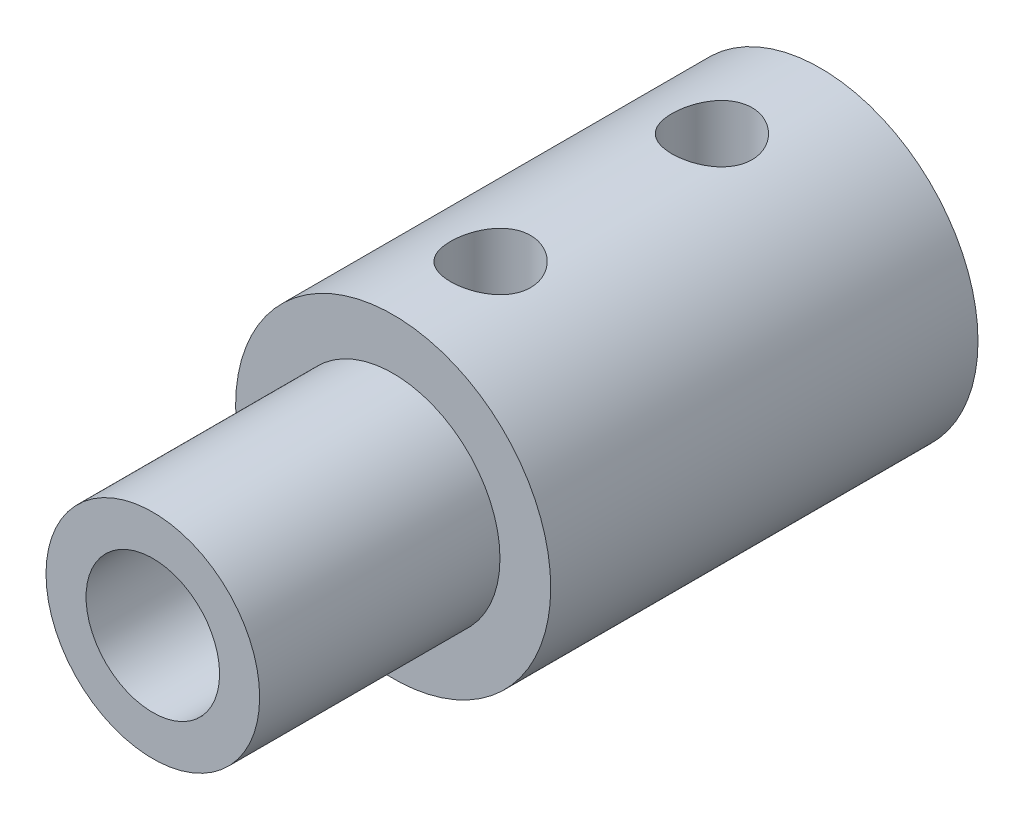
ISO-10303-21;
HEADER;
FILE_DESCRIPTION(('STEP AP214'),'2;1');
FILE_NAME('part.step','',(''),(''),'','','');
FILE_SCHEMA(('AUTOMOTIVE_DESIGN { 1 0 10303 214 1 1 1 1 }'));
ENDSEC;
DATA;
#1=APPLICATION_CONTEXT('core data for automotive mechanical design processes');
#2=APPLICATION_PROTOCOL_DEFINITION('international standard','automotive_design',2000,#1);
#3=PRODUCT_CONTEXT('',#1,'mechanical');
#4=PRODUCT('Part','Part','',(#3));
#5=PRODUCT_RELATED_PRODUCT_CATEGORY('part','',(#4));
#6=PRODUCT_DEFINITION_FORMATION('','',#4);
#7=PRODUCT_DEFINITION_CONTEXT('part definition',#1,'design');
#8=PRODUCT_DEFINITION('design','',#6,#7);
#9=PRODUCT_DEFINITION_SHAPE('','',#8);
#10=(LENGTH_UNIT() NAMED_UNIT(*) SI_UNIT(.MILLI.,.METRE.));
#11=(NAMED_UNIT(*) PLANE_ANGLE_UNIT() SI_UNIT($,.RADIAN.));
#12=(NAMED_UNIT(*) SI_UNIT($,.STERADIAN.) SOLID_ANGLE_UNIT());
#13=UNCERTAINTY_MEASURE_WITH_UNIT(LENGTH_MEASURE(1.E-05),#10,'distance_accuracy_value','');
#14=(GEOMETRIC_REPRESENTATION_CONTEXT(3) GLOBAL_UNCERTAINTY_ASSIGNED_CONTEXT((#13)) GLOBAL_UNIT_ASSIGNED_CONTEXT((#10,
#11,#12)) REPRESENTATION_CONTEXT('',''));
#15=CARTESIAN_POINT('',(0.,0.,0.));
#16=DIRECTION('',(0.,0.,1.));
#17=DIRECTION('',(1.,0.,0.));
#18=AXIS2_PLACEMENT_3D('',#15,#16,#17);
#19=CARTESIAN_POINT('',(0.,0.,25.));
#20=DIRECTION('',(0.,0.,-1.));
#21=DIRECTION('',(-1.,0.,0.));
#22=AXIS2_PLACEMENT_3D('',#19,#20,#21);
#23=CYLINDRICAL_SURFACE('',#22,5.9);
#24=CARTESIAN_POINT('',(0.,0.,0.));
#25=DIRECTION('',(0.,0.,1.));
#26=DIRECTION('',(1.,0.,0.));
#27=AXIS2_PLACEMENT_3D('',#24,#25,#26);
#28=CIRCLE('',#27,5.9);
#29=CARTESIAN_POINT('',(5.9,0.,0.));
#30=VERTEX_POINT('',#29);
#31=EDGE_CURVE('E136',#30,#30,#28,.T.);
#32=ORIENTED_EDGE('',*,*,#31,.T.);
#33=EDGE_LOOP('',(#32));
#34=FACE_BOUND('',#33,.T.);
#35=CARTESIAN_POINT('',(0.,5.9,5.56318232203257));
#36=CARTESIAN_POINT('',(-0.0828300382499491,5.89999863185022,5.5631800820789));
#37=CARTESIAN_POINT('',(-0.165684832863688,5.89823839931484,5.5562984452127));
#38=CARTESIAN_POINT('',(-0.329016763273005,5.89138713946882,5.52899680601431));
#39=CARTESIAN_POINT('',(-0.409492577152412,5.88629429539872,5.50856941919102));
#40=CARTESIAN_POINT('',(-0.565684557209917,5.87334130935857,5.45487639515155));
#41=CARTESIAN_POINT('',(-0.641406413346794,5.86548455288059,5.42162645938982));
#42=CARTESIAN_POINT('',(-0.786197875180384,5.84783888653407,5.34328816441978));
#43=CARTESIAN_POINT('',(-0.855267201012286,5.83804989543126,5.29819930745782));
#44=CARTESIAN_POINT('',(-0.986260236282176,5.81736852160733,5.19645145540983));
#45=CARTESIAN_POINT('',(-1.04802249224729,5.80645865200954,5.13958814605744));
#46=CARTESIAN_POINT('',(-1.16124449896803,5.78488032866515,5.01634279694619));
#47=CARTESIAN_POINT('',(-1.21270304730156,5.77421190322332,4.94995964779057));
#48=CARTESIAN_POINT('',(-1.30462316017259,5.75414745591023,4.80829665143822));
#49=CARTESIAN_POINT('',(-1.34490284311052,5.74477360042579,4.73289536205567));
#50=CARTESIAN_POINT('',(-1.4121517223974,5.72861518109046,4.57611467427445));
#51=CARTESIAN_POINT('',(-1.43912312697355,5.72183018771506,4.4947362702277));
#52=CARTESIAN_POINT('',(-1.47843656787613,5.71179764583944,4.33008994340507));
#53=CARTESIAN_POINT('',(-1.49106951185751,5.70847986708464,4.24689586218846));
#54=CARTESIAN_POINT('',(-1.5022537680738,5.70554728281267,4.07950813462008));
#55=CARTESIAN_POINT('',(-1.50080745483598,5.70593185287833,3.99531465921265));
#56=CARTESIAN_POINT('',(-1.48410606772934,5.71029745273476,3.83055775914648));
#57=CARTESIAN_POINT('',(-1.46919896212241,5.71418785001937,3.7499562826809));
#58=CARTESIAN_POINT('',(-1.42655478807359,5.72498214747374,3.59243755934651));
#59=CARTESIAN_POINT('',(-1.39881677783028,5.73188626885181,3.5155205833812));
#60=CARTESIAN_POINT('',(-1.33100488852097,5.74801240949616,3.36662767735329));
#61=CARTESIAN_POINT('',(-1.29080579577386,5.75725777350398,3.29471140945088));
#62=CARTESIAN_POINT('',(-1.19930036134028,5.77701165833937,3.15852104401564));
#63=CARTESIAN_POINT('',(-1.14799201509948,5.78752040697974,3.09424832893276));
#64=CARTESIAN_POINT('',(-1.03392786808934,5.80899752020269,2.97317692765593));
#65=CARTESIAN_POINT('',(-0.970878777414768,5.81997029361514,2.91665498131969));
#66=CARTESIAN_POINT('',(-0.836064673045031,5.84085966687947,2.81493297861713));
#67=CARTESIAN_POINT('',(-0.764299375001822,5.85077623225495,2.76973329176325));
#68=CARTESIAN_POINT('',(-0.61368678962163,5.86848800026142,2.69183225826974));
#69=CARTESIAN_POINT('',(-0.534814607701236,5.87627532733138,2.65917713551393));
#70=CARTESIAN_POINT('',(-0.372457781193937,5.88879402296901,2.60766712679283));
#71=CARTESIAN_POINT('',(-0.288974053507841,5.89352599666688,2.58880950805433));
#72=CARTESIAN_POINT('',(-0.122128930978258,5.899310781984,2.56585539211901));
#73=CARTESIAN_POINT('',(-0.0388225405440688,5.90045746482781,2.56138218639834));
#74=CARTESIAN_POINT('',(0.127348889786348,5.89921045786372,2.56628889450873));
#75=CARTESIAN_POINT('',(0.210213970139117,5.89681709839345,2.57566751576201));
#76=CARTESIAN_POINT('',(0.371832681358254,5.88881920506323,2.60770150109535));
#77=CARTESIAN_POINT('',(0.450629972839559,5.88326468368383,2.63015020889454));
#78=CARTESIAN_POINT('',(0.603335371703897,5.86957144444429,2.68745010669728));
#79=CARTESIAN_POINT('',(0.677242974838862,5.8614324605624,2.72230257347895));
#80=CARTESIAN_POINT('',(0.819561135349217,5.84324947975955,2.80414290500579));
#81=CARTESIAN_POINT('',(0.887847038351113,5.83317348261169,2.85134025797633));
#82=CARTESIAN_POINT('',(1.01566287928877,5.81228271270935,2.95626394260162));
#83=CARTESIAN_POINT('',(1.07519124827461,5.80146780808341,3.0139921567659));
#84=CARTESIAN_POINT('',(1.18536341320321,5.77997834225627,3.1400903149362));
#85=CARTESIAN_POINT('',(1.23574255151291,5.7693143569736,3.20869369287159));
#86=CARTESIAN_POINT('',(1.32427465688687,5.74964010495377,3.35360193327322));
#87=CARTESIAN_POINT('',(1.36242816150323,5.74062976551446,3.42990645693172));
#88=CARTESIAN_POINT('',(1.42514033179541,5.72538357168284,3.58764703270656));
#89=CARTESIAN_POINT('',(1.44977937476193,5.71913135785691,3.66904946499343));
#90=CARTESIAN_POINT('',(1.484970272922,5.71009628596941,3.83502544986968));
#91=CARTESIAN_POINT('',(1.49552533544564,5.70731263802452,3.91959827595684));
#92=CARTESIAN_POINT('',(1.50207678454967,5.70559153423418,4.08681720122587));
#93=CARTESIAN_POINT('',(1.49849674160241,5.70654217289633,4.16944581469832));
#94=CARTESIAN_POINT('',(1.47785227797149,5.71192298396535,4.33287961682107));
#95=CARTESIAN_POINT('',(1.4607881464442,5.71635308175778,4.41368484453432));
#96=CARTESIAN_POINT('',(1.41389485565978,5.72813020683422,4.57069954576439));
#97=CARTESIAN_POINT('',(1.38414770718958,5.73545847233807,4.6469350168247));
#98=CARTESIAN_POINT('',(1.3127973032129,5.75220828882475,4.79338838288983));
#99=CARTESIAN_POINT('',(1.27119234814895,5.76163013983463,4.86360541340482));
#100=CARTESIAN_POINT('',(1.17599044237874,5.78182245060816,4.99806933782921));
#101=CARTESIAN_POINT('',(1.12210078652748,5.79262238972102,5.06210459916992));
#102=CARTESIAN_POINT('',(1.00442620910812,5.81418091410334,5.18036092562567));
#103=CARTESIAN_POINT('',(0.94063892839525,5.82493948888527,5.23457964422868));
#104=CARTESIAN_POINT('',(0.803524205218609,5.84544595559965,5.33266546394606));
#105=CARTESIAN_POINT('',(0.730039189018958,5.8551708925873,5.37631746480501));
#106=CARTESIAN_POINT('',(0.576532096973004,5.8722700689399,5.45057888376458));
#107=CARTESIAN_POINT('',(0.49651463189131,5.87964594861095,5.48119740796729));
#108=CARTESIAN_POINT('',(0.347230792472993,5.89015920699172,5.52411376443182));
#109=CARTESIAN_POINT('',(0.27865943664934,5.89382377720494,5.53873223018998));
#110=CARTESIAN_POINT('',(0.140064542759633,5.89874465504578,5.55826706478892));
#111=CARTESIAN_POINT('',(0.0700411222776746,5.90000115690815,5.56318421613853));
#112=CARTESIAN_POINT('',(0.,5.9,5.56318232203257));
#113=B_SPLINE_CURVE_WITH_KNOTS('',3,(#35,#36,#37,#38,#39,#40,#41,#42,#43,#44,#45,#46,#47,#48,
#49,#50,#51,#52,#53,#54,#55,#56,#57,#58,#59,#60,#61,#62,#63,#64,#65,#66,#67,#68,#69,#70,#71,#72,
#73,#74,#75,#76,#77,#78,#79,#80,#81,#82,#83,#84,#85,#86,#87,#88,#89,#90,#91,#92,#93,#94,#95,#96,
#97,#98,#99,#100,#101,#102,#103,#104,#105,#106,#107,#108,#109,#110,#111,#112),.UNSPECIFIED.,.T.,
.F.,(4,2,2,2,2,2,2,2,2,2,2,2,2,2,2,2,2,2,2,2,2,2,2,2,2,2,2,2,2,2,2,2,2,2,2,2,2,2,4),(0.,
0.248233394491255,0.496602225258984,0.744667884467358,0.992743974977818,1.2455526134713,
1.49839073705538,1.75512908076637,2.01182480984364,2.26321383822943,2.51456046950916,
2.7595900223528,3.00463756346888,3.25223194832833,3.4998710464196,3.75482258942745,
4.00978245193162,4.26567297297126,4.52151279787067,4.77059551627814,5.01965499309823,
5.26487950095513,5.51012925824523,5.7598463644529,6.00960815421591,6.26572614204238,
6.52183286700362,6.77639940759489,7.03090796611494,7.27784869958148,7.52478413772932,
7.77014649916532,8.01554404563502,8.26754847835888,8.51961307003948,8.77644345520998,
9.03309410493866,9.24301732210762,9.45292360616001),.UNSPECIFIED.);
#114=CARTESIAN_POINT('',(0.,5.9,5.56318232203257));
#115=VERTEX_POINT('',#114);
#116=EDGE_CURVE('E91',#115,#115,#113,.T.);
#117=ORIENTED_EDGE('',*,*,#116,.T.);
#118=EDGE_LOOP('',(#117));
#119=FACE_BOUND('',#118,.T.);
#120=CARTESIAN_POINT('',(0.,5.9,13.8526320056251));
#121=CARTESIAN_POINT('',(-0.0828300382499491,5.89999863185022,13.8526297656714));
#122=CARTESIAN_POINT('',(-0.165684832863688,5.89823839931484,13.8457481288052));
#123=CARTESIAN_POINT('',(-0.329016763273004,5.89138713946882,13.8184464896068));
#124=CARTESIAN_POINT('',(-0.409492577152412,5.88629429539872,13.7980191027835));
#125=CARTESIAN_POINT('',(-0.565684557209916,5.87334130935857,13.744326078744));
#126=CARTESIAN_POINT('',(-0.641406413346792,5.86548455288059,13.7110761429823));
#127=CARTESIAN_POINT('',(-0.786197875180382,5.84783888653407,13.6327378480123));
#128=CARTESIAN_POINT('',(-0.855267201012284,5.83804989543126,13.5876489910503));
#129=CARTESIAN_POINT('',(-0.986260236282175,5.81736852160734,13.4859011390023));
#130=CARTESIAN_POINT('',(-1.04802249224729,5.80645865200954,13.4290378296499));
#131=CARTESIAN_POINT('',(-1.16124449896803,5.78488032866515,13.3057924805387));
#132=CARTESIAN_POINT('',(-1.21270304730156,5.77421190322332,13.2394093313831));
#133=CARTESIAN_POINT('',(-1.30462316017259,5.75414745591023,13.0977463350307));
#134=CARTESIAN_POINT('',(-1.34490284311052,5.74477360042579,13.0223450456482));
#135=CARTESIAN_POINT('',(-1.4121517223974,5.72861518109046,12.8655643578669));
#136=CARTESIAN_POINT('',(-1.43912312697355,5.72183018771507,12.7841859538202));
#137=CARTESIAN_POINT('',(-1.47843656787613,5.71179764583944,12.6195396269976));
#138=CARTESIAN_POINT('',(-1.49106951185751,5.70847986708464,12.5363455457809));
#139=CARTESIAN_POINT('',(-1.5022537680738,5.70554728281267,12.3689578182126));
#140=CARTESIAN_POINT('',(-1.50080745483598,5.70593185287833,12.2847643428051));
#141=CARTESIAN_POINT('',(-1.48410606772934,5.71029745273476,12.120007442739));
#142=CARTESIAN_POINT('',(-1.46919896212241,5.71418785001937,12.0394059662734));
#143=CARTESIAN_POINT('',(-1.42655478807359,5.72498214747374,11.881887242939));
#144=CARTESIAN_POINT('',(-1.39881677783028,5.73188626885181,11.8049702669737));
#145=CARTESIAN_POINT('',(-1.33100488852097,5.74801240949616,11.6560773609458));
#146=CARTESIAN_POINT('',(-1.29080579577386,5.75725777350398,11.5841610930434));
#147=CARTESIAN_POINT('',(-1.19930036134028,5.77701165833937,11.4479707276081));
#148=CARTESIAN_POINT('',(-1.14799201509948,5.78752040697974,11.3836980125252));
#149=CARTESIAN_POINT('',(-1.03392786808934,5.80899752020269,11.2626266112484));
#150=CARTESIAN_POINT('',(-0.970878777414768,5.81997029361514,11.2061046649122));
#151=CARTESIAN_POINT('',(-0.836064673045031,5.84085966687947,11.1043826622096));
#152=CARTESIAN_POINT('',(-0.764299375001822,5.85077623225495,11.0591829753557));
#153=CARTESIAN_POINT('',(-0.613686789621631,5.86848800026142,10.9812819418622));
#154=CARTESIAN_POINT('',(-0.534814607701238,5.87627532733138,10.9486268191064));
#155=CARTESIAN_POINT('',(-0.372457781193938,5.888794022969,10.8971168103853));
#156=CARTESIAN_POINT('',(-0.288974053507842,5.89352599666688,10.8782591916468));
#157=CARTESIAN_POINT('',(-0.122128930978259,5.899310781984,10.8553050757115));
#158=CARTESIAN_POINT('',(-0.03882254054407,5.90045746482781,10.8508318699908));
#159=CARTESIAN_POINT('',(0.127348889786347,5.89921045786372,10.8557385781012));
#160=CARTESIAN_POINT('',(0.210213970139116,5.89681709839345,10.8651171993545));
#161=CARTESIAN_POINT('',(0.371832681358253,5.88881920506323,10.8971511846878));
#162=CARTESIAN_POINT('',(0.450629972839558,5.88326468368383,10.919599892487));
#163=CARTESIAN_POINT('',(0.603335371703896,5.86957144444429,10.9768997902898));
#164=CARTESIAN_POINT('',(0.677242974838861,5.8614324605624,11.0117522570714));
#165=CARTESIAN_POINT('',(0.819561135349216,5.84324947975955,11.0935925885983));
#166=CARTESIAN_POINT('',(0.887847038351112,5.83317348261169,11.1407899415688));
#167=CARTESIAN_POINT('',(1.01566287928877,5.81228271270935,11.2457136261941));
#168=CARTESIAN_POINT('',(1.07519124827461,5.80146780808341,11.3034418403584));
#169=CARTESIAN_POINT('',(1.1853634132032,5.77997834225627,11.4295399985287));
#170=CARTESIAN_POINT('',(1.23574255151291,5.7693143569736,11.4981433764641));
#171=CARTESIAN_POINT('',(1.32427465688686,5.74964010495377,11.6430516168657));
#172=CARTESIAN_POINT('',(1.36242816150323,5.74062976551446,11.7193561405242));
#173=CARTESIAN_POINT('',(1.42514033179541,5.72538357168284,11.877096716299));
#174=CARTESIAN_POINT('',(1.44977937476193,5.71913135785691,11.9584991485859));
#175=CARTESIAN_POINT('',(1.484970272922,5.71009628596941,12.1244751334622));
#176=CARTESIAN_POINT('',(1.49552533544564,5.70731263802452,12.2090479595493));
#177=CARTESIAN_POINT('',(1.50207678454967,5.70559153423418,12.3762668848184));
#178=CARTESIAN_POINT('',(1.49849674160241,5.70654217289633,12.4588954982908));
#179=CARTESIAN_POINT('',(1.47785227797149,5.71192298396535,12.6223293004136));
#180=CARTESIAN_POINT('',(1.4607881464442,5.71635308175778,12.7031345281268));
#181=CARTESIAN_POINT('',(1.41389485565978,5.72813020683422,12.8601492293569));
#182=CARTESIAN_POINT('',(1.38414770718958,5.73545847233807,12.9363847004172));
#183=CARTESIAN_POINT('',(1.3127973032129,5.75220828882475,13.0828380664823));
#184=CARTESIAN_POINT('',(1.27119234814895,5.76163013983464,13.1530550969973));
#185=CARTESIAN_POINT('',(1.17599044237874,5.78182245060816,13.2875190214217));
#186=CARTESIAN_POINT('',(1.12210078652748,5.79262238972102,13.3515542827624));
#187=CARTESIAN_POINT('',(1.00442620910812,5.81418091410334,13.4698106092182));
#188=CARTESIAN_POINT('',(0.94063892839525,5.82493948888527,13.5240293278212));
#189=CARTESIAN_POINT('',(0.803524205218608,5.84544595559965,13.6221151475385));
#190=CARTESIAN_POINT('',(0.730039189018957,5.8551708925873,13.6657671483975));
#191=CARTESIAN_POINT('',(0.576532096973004,5.8722700689399,13.7400285673571));
#192=CARTESIAN_POINT('',(0.49651463189131,5.87964594861095,13.7706470915598));
#193=CARTESIAN_POINT('',(0.347230792472993,5.89015920699172,13.8135634480243));
#194=CARTESIAN_POINT('',(0.27865943664934,5.89382377720494,13.8281819137825));
#195=CARTESIAN_POINT('',(0.140064542759633,5.89874465504578,13.8477167483814));
#196=CARTESIAN_POINT('',(0.0700411222776747,5.90000115690815,13.852633899731));
#197=CARTESIAN_POINT('',(0.,5.9,13.8526320056251));
#198=B_SPLINE_CURVE_WITH_KNOTS('',3,(#120,#121,#122,#123,#124,#125,#126,#127,#128,#129,#130,
#131,#132,#133,#134,#135,#136,#137,#138,#139,#140,#141,#142,#143,#144,#145,#146,#147,#148,#149,
#150,#151,#152,#153,#154,#155,#156,#157,#158,#159,#160,#161,#162,#163,#164,#165,#166,#167,#168,
#169,#170,#171,#172,#173,#174,#175,#176,#177,#178,#179,#180,#181,#182,#183,#184,#185,#186,#187,
#188,#189,#190,#191,#192,#193,#194,#195,#196,#197),.UNSPECIFIED.,.T.,.F.,(4,2,2,2,2,2,2,2,2,2,2,
2,2,2,2,2,2,2,2,2,2,2,2,2,2,2,2,2,2,2,2,2,2,2,2,2,2,2,4),(0.,0.248233394491255,
0.496602225258983,0.744667884467356,0.992743974977816,1.2455526134713,1.49839073705538,
1.75512908076637,2.01182480984364,2.26321383822943,2.51456046950916,2.75959002235279,
3.00463756346887,3.25223194832833,3.4998710464196,3.75482258942745,4.00978245193162,
4.26567297297125,4.52151279787067,4.77059551627814,5.01965499309823,5.26487950095513,
5.51012925824523,5.7598463644529,6.00960815421591,6.26572614204238,6.52183286700362,
6.77639940759489,7.03090796611494,7.27784869958148,7.52478413772932,7.77014649916532,
8.01554404563502,8.26754847835888,8.51961307003948,8.77644345520998,9.03309410493866,
9.24301732210763,9.45292360616002),.UNSPECIFIED.);
#199=CARTESIAN_POINT('',(0.,5.9,13.8526320056251));
#200=VERTEX_POINT('',#199);
#201=EDGE_CURVE('E82',#200,#200,#198,.T.);
#202=ORIENTED_EDGE('',*,*,#201,.T.);
#203=EDGE_LOOP('',(#202));
#204=FACE_BOUND('',#203,.T.);
#205=CARTESIAN_POINT('',(0.,0.,16.));
#206=DIRECTION('',(0.,0.,1.));
#207=DIRECTION('',(1.,0.,0.));
#208=AXIS2_PLACEMENT_3D('',#205,#206,#207);
#209=CIRCLE('',#208,5.9);
#210=CARTESIAN_POINT('',(5.9,0.,16.));
#211=VERTEX_POINT('',#210);
#212=EDGE_CURVE('E144',#211,#211,#209,.T.);
#213=ORIENTED_EDGE('',*,*,#212,.F.);
#214=EDGE_LOOP('',(#213));
#215=FACE_BOUND('',#214,.T.);
#216=ADVANCED_FACE('F31',(#34,#119,#204,#215),#23,.T.);
#217=CARTESIAN_POINT('',(0.,0.,25.));
#218=DIRECTION('',(0.,0.,1.));
#219=DIRECTION('',(1.,0.,0.));
#220=AXIS2_PLACEMENT_3D('',#217,#218,#219);
#221=PLANE('',#220);
#222=CARTESIAN_POINT('',(0.,0.,25.));
#223=DIRECTION('',(0.,0.,1.));
#224=DIRECTION('',(1.,0.,0.));
#225=AXIS2_PLACEMENT_3D('',#222,#223,#224);
#226=CIRCLE('',#225,2.5);
#227=CARTESIAN_POINT('',(2.5,0.,25.));
#228=VERTEX_POINT('',#227);
#229=EDGE_CURVE('E193',#228,#228,#226,.T.);
#230=ORIENTED_EDGE('',*,*,#229,.F.);
#231=EDGE_LOOP('',(#230));
#232=FACE_BOUND('',#231,.T.);
#233=CARTESIAN_POINT('',(0.,0.,25.));
#234=DIRECTION('',(0.,0.,1.));
#235=DIRECTION('',(1.,0.,0.));
#236=AXIS2_PLACEMENT_3D('',#233,#234,#235);
#237=CIRCLE('',#236,4.);
#238=CARTESIAN_POINT('',(4.,0.,25.));
#239=VERTEX_POINT('',#238);
#240=EDGE_CURVE('E149',#239,#239,#237,.T.);
#241=ORIENTED_EDGE('',*,*,#240,.T.);
#242=EDGE_LOOP('',(#241));
#243=FACE_BOUND('',#242,.T.);
#244=ADVANCED_FACE('F112',(#232,#243),#221,.T.);
#245=CARTESIAN_POINT('',(0.,0.,15.));
#246=DIRECTION('',(0.,0.,-1.));
#247=DIRECTION('',(-1.,0.,0.));
#248=AXIS2_PLACEMENT_3D('',#245,#246,#247);
#249=CYLINDRICAL_SURFACE('',#248,1.5);
#250=DIRECTION('',(0.,0.,-1.));
#251=VECTOR('',#250,1.);
#252=CARTESIAN_POINT('',(1.11803398874989,1.00000000000001,15.));
#253=LINE('',#252,#251);
#254=CARTESIAN_POINT('',(1.11803398874989,1.00000000000001,3.06318232203257));
#255=VERTEX_POINT('',#254);
#256=CARTESIAN_POINT('',(1.11803398874989,1.00000000000001,5.06318232203258));
#257=VERTEX_POINT('',#256);
#258=EDGE_CURVE('E177',#255,#257,#253,.F.);
#259=ORIENTED_EDGE('',*,*,#258,.F.);
#260=CARTESIAN_POINT('',(0.,0.,4.06318232203257));
#261=DIRECTION('',(0.,-0.707106781186547,-0.707106781186547));
#262=DIRECTION('',(0.,0.707106781186547,-0.707106781186547));
#263=AXIS2_PLACEMENT_3D('',#260,#261,#262);
#264=ELLIPSE('',#263,2.12132034355964,1.5);
#265=CARTESIAN_POINT('',(-1.11803398874989,1.00000000000001,3.06318232203257));
#266=VERTEX_POINT('',#265);
#267=EDGE_CURVE('E184',#255,#266,#264,.F.);
#268=ORIENTED_EDGE('',*,*,#267,.T.);
#269=DIRECTION('',(0.,0.,-1.));
#270=VECTOR('',#269,1.);
#271=CARTESIAN_POINT('',(-1.11803398874989,1.00000000000001,15.));
#272=LINE('',#271,#270);
#273=CARTESIAN_POINT('',(-1.11803398874989,1.00000000000001,5.06318232203258));
#274=VERTEX_POINT('',#273);
#275=EDGE_CURVE('E187',#274,#266,#272,.T.);
#276=ORIENTED_EDGE('',*,*,#275,.F.);
#277=CARTESIAN_POINT('',(0.,0.,4.06318232203257));
#278=DIRECTION('',(0.,0.707106781186547,-0.707106781186547));
#279=DIRECTION('',(0.,-0.707106781186547,-0.707106781186547));
#280=AXIS2_PLACEMENT_3D('',#277,#278,#279);
#281=ELLIPSE('',#280,2.12132034355964,1.5);
#282=EDGE_CURVE('E179',#274,#257,#281,.T.);
#283=ORIENTED_EDGE('',*,*,#282,.T.);
#284=EDGE_LOOP('',(#259,#268,#276,#283));
#285=FACE_BOUND('',#284,.T.);
#286=CARTESIAN_POINT('',(0.,0.,15.));
#287=DIRECTION('',(0.,0.,-1.));
#288=DIRECTION('',(-1.,0.,0.));
#289=AXIS2_PLACEMENT_3D('',#286,#287,#288);
#290=CIRCLE('',#289,1.5);
#291=CARTESIAN_POINT('',(-1.5,0.,15.));
#292=VERTEX_POINT('',#291);
#293=EDGE_CURVE('E98',#292,#292,#290,.T.);
#294=ORIENTED_EDGE('',*,*,#293,.F.);
#295=EDGE_LOOP('',(#294));
#296=FACE_BOUND('',#295,.T.);
#297=CARTESIAN_POINT('',(0.,0.,0.));
#298=DIRECTION('',(0.,0.,-1.));
#299=DIRECTION('',(-1.,0.,0.));
#300=AXIS2_PLACEMENT_3D('',#297,#298,#299);
#301=CIRCLE('',#300,1.5);
#302=CARTESIAN_POINT('',(-1.5,0.,0.));
#303=VERTEX_POINT('',#302);
#304=EDGE_CURVE('E97',#303,#303,#301,.T.);
#305=ORIENTED_EDGE('',*,*,#304,.T.);
#306=EDGE_LOOP('',(#305));
#307=FACE_BOUND('',#306,.T.);
#308=DIRECTION('',(0.,0.,-1.));
#309=VECTOR('',#308,1.);
#310=CARTESIAN_POINT('',(1.11803398874989,1.00000000000001,15.));
#311=LINE('',#310,#309);
#312=CARTESIAN_POINT('',(1.11803398874989,1.00000000000001,11.352632005625));
#313=VERTEX_POINT('',#312);
#314=CARTESIAN_POINT('',(1.11803398874989,1.00000000000001,13.3526320056251));
#315=VERTEX_POINT('',#314);
#316=EDGE_CURVE('E11',#313,#315,#311,.F.);
#317=ORIENTED_EDGE('',*,*,#316,.F.);
#318=CARTESIAN_POINT('',(0.,0.,12.3526320056251));
#319=DIRECTION('',(0.,-0.707106781186547,-0.707106781186547));
#320=DIRECTION('',(0.,0.707106781186547,-0.707106781186547));
#321=AXIS2_PLACEMENT_3D('',#318,#319,#320);
#322=ELLIPSE('',#321,2.12132034355964,1.5);
#323=CARTESIAN_POINT('',(-1.11803398874989,1.00000000000001,11.352632005625));
#324=VERTEX_POINT('',#323);
#325=EDGE_CURVE('E81',#313,#324,#322,.F.);
#326=ORIENTED_EDGE('',*,*,#325,.T.);
#327=DIRECTION('',(0.,0.,-1.));
#328=VECTOR('',#327,1.);
#329=CARTESIAN_POINT('',(-1.11803398874989,1.00000000000001,15.));
#330=LINE('',#329,#328);
#331=CARTESIAN_POINT('',(-1.11803398874989,1.00000000000001,13.3526320056251));
#332=VERTEX_POINT('',#331);
#333=EDGE_CURVE('E39',#332,#324,#330,.T.);
#334=ORIENTED_EDGE('',*,*,#333,.F.);
#335=CARTESIAN_POINT('',(0.,0.,12.3526320056251));
#336=DIRECTION('',(0.,0.707106781186547,-0.707106781186547));
#337=DIRECTION('',(0.,-0.707106781186547,-0.707106781186547));
#338=AXIS2_PLACEMENT_3D('',#335,#336,#337);
#339=ELLIPSE('',#338,2.12132034355964,1.5);
#340=EDGE_CURVE('E79',#332,#315,#339,.T.);
#341=ORIENTED_EDGE('',*,*,#340,.T.);
#342=EDGE_LOOP('',(#317,#326,#334,#341));
#343=FACE_BOUND('',#342,.T.);
#344=ADVANCED_FACE('F84',(#285,#296,#307,#343),#249,.F.);
#345=CARTESIAN_POINT('',(0.,0.,0.));
#346=DIRECTION('',(0.,0.,1.));
#347=DIRECTION('',(1.,0.,0.));
#348=AXIS2_PLACEMENT_3D('',#345,#346,#347);
#349=PLANE('',#348);
#350=ORIENTED_EDGE('',*,*,#304,.F.);
#351=EDGE_LOOP('',(#350));
#352=FACE_BOUND('',#351,.T.);
#353=ORIENTED_EDGE('',*,*,#31,.F.);
#354=EDGE_LOOP('',(#353));
#355=FACE_BOUND('',#354,.T.);
#356=ADVANCED_FACE('F111',(#352,#355),#349,.F.);
#357=CARTESIAN_POINT('',(0.,0.,15.));
#358=DIRECTION('',(0.,0.,1.));
#359=DIRECTION('',(1.,0.,0.));
#360=AXIS2_PLACEMENT_3D('',#357,#358,#359);
#361=CYLINDRICAL_SURFACE('',#360,2.5);
#362=CARTESIAN_POINT('',(0.,0.,15.));
#363=DIRECTION('',(0.,0.,1.));
#364=DIRECTION('',(1.,0.,0.));
#365=AXIS2_PLACEMENT_3D('',#362,#363,#364);
#366=CIRCLE('',#365,2.5);
#367=CARTESIAN_POINT('',(2.5,0.,15.));
#368=VERTEX_POINT('',#367);
#369=EDGE_CURVE('E192',#368,#368,#366,.T.);
#370=ORIENTED_EDGE('',*,*,#369,.F.);
#371=EDGE_LOOP('',(#370));
#372=FACE_BOUND('',#371,.T.);
#373=ORIENTED_EDGE('',*,*,#229,.T.);
#374=EDGE_LOOP('',(#373));
#375=FACE_BOUND('',#374,.T.);
#376=ADVANCED_FACE('F116',(#372,#375),#361,.F.);
#377=CARTESIAN_POINT('',(0.,0.,15.));
#378=DIRECTION('',(0.,0.,1.));
#379=DIRECTION('',(1.,0.,0.));
#380=AXIS2_PLACEMENT_3D('',#377,#378,#379);
#381=PLANE('',#380);
#382=ORIENTED_EDGE('',*,*,#293,.T.);
#383=EDGE_LOOP('',(#382));
#384=FACE_BOUND('',#383,.T.);
#385=ORIENTED_EDGE('',*,*,#369,.T.);
#386=EDGE_LOOP('',(#385));
#387=FACE_BOUND('',#386,.T.);
#388=ADVANCED_FACE('F106',(#384,#387),#381,.T.);
#389=CARTESIAN_POINT('',(0.,1.00000000000001,4.06318232203257));
#390=DIRECTION('',(0.,1.,0.));
#391=DIRECTION('',(0.,0.,1.));
#392=AXIS2_PLACEMENT_3D('',#389,#390,#391);
#393=CYLINDRICAL_SURFACE('',#392,1.5);
#394=CARTESIAN_POINT('',(0.,1.00000000000001,4.06318232203257));
#395=DIRECTION('',(0.,1.,0.));
#396=DIRECTION('',(0.,0.,1.));
#397=AXIS2_PLACEMENT_3D('',#394,#395,#396);
#398=CIRCLE('',#397,1.5);
#399=EDGE_CURVE('E52',#266,#274,#398,.T.);
#400=ORIENTED_EDGE('',*,*,#399,.F.);
#401=ORIENTED_EDGE('',*,*,#267,.F.);
#402=EDGE_CURVE('E86',#257,#255,#398,.T.);
#403=ORIENTED_EDGE('',*,*,#402,.F.);
#404=ORIENTED_EDGE('',*,*,#282,.F.);
#405=EDGE_LOOP('',(#400,#401,#403,#404));
#406=FACE_BOUND('',#405,.T.);
#407=ORIENTED_EDGE('',*,*,#116,.F.);
#408=EDGE_LOOP('',(#407));
#409=FACE_BOUND('',#408,.T.);
#410=ADVANCED_FACE('F100',(#406,#409),#393,.F.);
#411=CARTESIAN_POINT('',(0.,1.00000000000001,4.06318232203257));
#412=DIRECTION('',(0.,1.,0.));
#413=DIRECTION('',(0.,0.,1.));
#414=AXIS2_PLACEMENT_3D('',#411,#412,#413);
#415=PLANE('',#414);
#416=ORIENTED_EDGE('',*,*,#258,.T.);
#417=ORIENTED_EDGE('',*,*,#402,.T.);
#418=EDGE_LOOP('',(#416,#417));
#419=FACE_BOUND('',#418,.T.);
#420=ADVANCED_FACE('F105',(#419),#415,.T.);
#421=ORIENTED_EDGE('',*,*,#275,.T.);
#422=ORIENTED_EDGE('',*,*,#399,.T.);
#423=EDGE_LOOP('',(#421,#422));
#424=FACE_BOUND('',#423,.T.);
#425=ADVANCED_FACE('F169',(#424),#415,.T.);
#426=CARTESIAN_POINT('',(0.,1.00000000000001,12.3526320056251));
#427=DIRECTION('',(0.,1.,0.));
#428=DIRECTION('',(0.,0.,1.));
#429=AXIS2_PLACEMENT_3D('',#426,#427,#428);
#430=PLANE('',#429);
#431=ORIENTED_EDGE('',*,*,#316,.T.);
#432=CARTESIAN_POINT('',(0.,1.00000000000001,12.3526320056251));
#433=DIRECTION('',(0.,1.,0.));
#434=DIRECTION('',(0.,0.,1.));
#435=AXIS2_PLACEMENT_3D('',#432,#433,#434);
#436=CIRCLE('',#435,1.5);
#437=EDGE_CURVE('E73',#315,#313,#436,.T.);
#438=ORIENTED_EDGE('',*,*,#437,.T.);
#439=EDGE_LOOP('',(#431,#438));
#440=FACE_BOUND('',#439,.T.);
#441=ADVANCED_FACE('F72',(#440),#430,.T.);
#442=ORIENTED_EDGE('',*,*,#333,.T.);
#443=EDGE_CURVE('E45',#324,#332,#436,.T.);
#444=ORIENTED_EDGE('',*,*,#443,.T.);
#445=EDGE_LOOP('',(#442,#444));
#446=FACE_BOUND('',#445,.T.);
#447=ADVANCED_FACE('F168',(#446),#430,.T.);
#448=CARTESIAN_POINT('',(0.,1.00000000000001,12.3526320056251));
#449=DIRECTION('',(0.,1.,0.));
#450=DIRECTION('',(0.,0.,1.));
#451=AXIS2_PLACEMENT_3D('',#448,#449,#450);
#452=CYLINDRICAL_SURFACE('',#451,1.5);
#453=ORIENTED_EDGE('',*,*,#201,.F.);
#454=EDGE_LOOP('',(#453));
#455=FACE_BOUND('',#454,.T.);
#456=ORIENTED_EDGE('',*,*,#443,.F.);
#457=ORIENTED_EDGE('',*,*,#325,.F.);
#458=ORIENTED_EDGE('',*,*,#437,.F.);
#459=ORIENTED_EDGE('',*,*,#340,.F.);
#460=EDGE_LOOP('',(#456,#457,#458,#459));
#461=FACE_BOUND('',#460,.T.);
#462=ADVANCED_FACE('F78',(#455,#461),#452,.F.);
#463=CARTESIAN_POINT('',(0.,0.,16.));
#464=DIRECTION('',(0.,0.,1.));
#465=DIRECTION('',(1.,0.,0.));
#466=AXIS2_PLACEMENT_3D('',#463,#464,#465);
#467=PLANE('',#466);
#468=CARTESIAN_POINT('',(0.,0.,16.));
#469=DIRECTION('',(0.,0.,1.));
#470=DIRECTION('',(1.,0.,0.));
#471=AXIS2_PLACEMENT_3D('',#468,#469,#470);
#472=CIRCLE('',#471,4.);
#473=CARTESIAN_POINT('',(4.,0.,16.));
#474=VERTEX_POINT('',#473);
#475=EDGE_CURVE('E146',#474,#474,#472,.T.);
#476=ORIENTED_EDGE('',*,*,#475,.F.);
#477=EDGE_LOOP('',(#476));
#478=FACE_BOUND('',#477,.T.);
#479=ORIENTED_EDGE('',*,*,#212,.T.);
#480=EDGE_LOOP('',(#479));
#481=FACE_BOUND('',#480,.T.);
#482=ADVANCED_FACE('F158',(#478,#481),#467,.T.);
#483=CARTESIAN_POINT('',(0.,0.,16.));
#484=DIRECTION('',(0.,0.,1.));
#485=DIRECTION('',(1.,0.,0.));
#486=AXIS2_PLACEMENT_3D('',#483,#484,#485);
#487=CYLINDRICAL_SURFACE('',#486,4.);
#488=ORIENTED_EDGE('',*,*,#475,.T.);
#489=EDGE_LOOP('',(#488));
#490=FACE_BOUND('',#489,.T.);
#491=ORIENTED_EDGE('',*,*,#240,.F.);
#492=EDGE_LOOP('',(#491));
#493=FACE_BOUND('',#492,.T.);
#494=ADVANCED_FACE('F156',(#490,#493),#487,.T.);
#495=CLOSED_SHELL('',(#216,#244,#344,#356,#376,#388,#410,#420,#425,#441,#447,#462,#482,#494));
#496=MANIFOLD_SOLID_BREP('B2',#495);
#497=ADVANCED_BREP_SHAPE_REPRESENTATION('',(#18,#496),#14);
#498=SHAPE_DEFINITION_REPRESENTATION(#9,#497);
ENDSEC;
END-ISO-10303-21;
